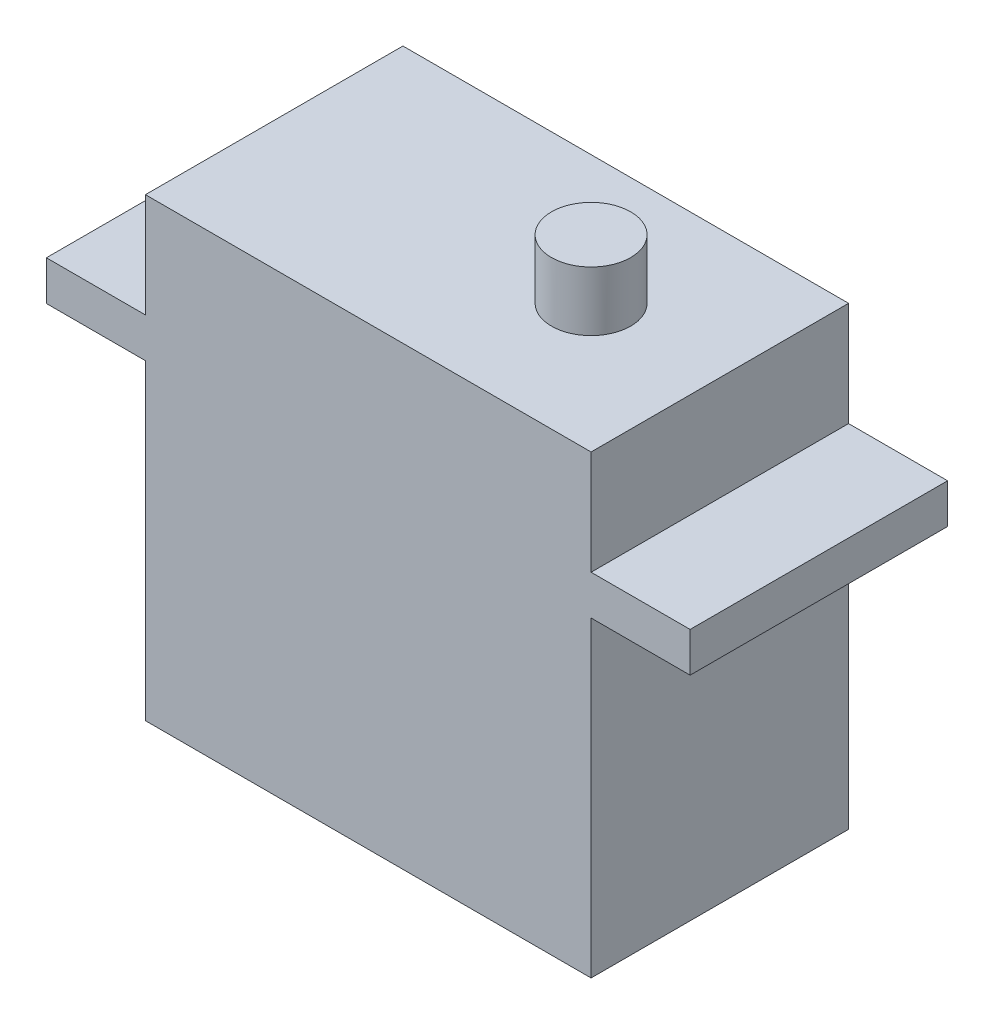
ISO-10303-21;
HEADER;
FILE_DESCRIPTION(('STEP AP214'),'2;1');
FILE_NAME('part.step','',(''),(''),'','','');
FILE_SCHEMA(('AUTOMOTIVE_DESIGN { 1 0 10303 214 1 1 1 1 }'));
ENDSEC;
DATA;
#1=APPLICATION_CONTEXT('core data for automotive mechanical design processes');
#2=APPLICATION_PROTOCOL_DEFINITION('international standard','automotive_design',2000,#1);
#3=PRODUCT_CONTEXT('',#1,'mechanical');
#4=PRODUCT('Part','Part','',(#3));
#5=PRODUCT_RELATED_PRODUCT_CATEGORY('part','',(#4));
#6=PRODUCT_DEFINITION_FORMATION('','',#4);
#7=PRODUCT_DEFINITION_CONTEXT('part definition',#1,'design');
#8=PRODUCT_DEFINITION('design','',#6,#7);
#9=PRODUCT_DEFINITION_SHAPE('','',#8);
#10=(LENGTH_UNIT() NAMED_UNIT(*) SI_UNIT(.MILLI.,.METRE.));
#11=(NAMED_UNIT(*) PLANE_ANGLE_UNIT() SI_UNIT($,.RADIAN.));
#12=(NAMED_UNIT(*) SI_UNIT($,.STERADIAN.) SOLID_ANGLE_UNIT());
#13=UNCERTAINTY_MEASURE_WITH_UNIT(LENGTH_MEASURE(1.E-05),#10,'distance_accuracy_value','');
#14=(GEOMETRIC_REPRESENTATION_CONTEXT(3) GLOBAL_UNCERTAINTY_ASSIGNED_CONTEXT((#13)) GLOBAL_UNIT_ASSIGNED_CONTEXT((#10,
#11,#12)) REPRESENTATION_CONTEXT('',''));
#15=CARTESIAN_POINT('',(0.,0.,0.));
#16=DIRECTION('',(0.,0.,1.));
#17=DIRECTION('',(1.,0.,0.));
#18=AXIS2_PLACEMENT_3D('',#15,#16,#17);
#19=CARTESIAN_POINT('',(-30.9036363636364,29.7093162393162,13.));
#20=DIRECTION('',(0.,-1.,0.));
#21=DIRECTION('',(0.,0.,-1.));
#22=AXIS2_PLACEMENT_3D('',#19,#20,#21);
#23=PLANE('',#22);
#24=DIRECTION('',(-1.,0.,0.));
#25=VECTOR('',#24,1.);
#26=CARTESIAN_POINT('',(-30.9036363636364,29.7093162393162,0.));
#27=LINE('',#26,#25);
#28=CARTESIAN_POINT('',(-8.40363636363642,29.7093162393162,0.));
#29=VERTEX_POINT('',#28);
#30=CARTESIAN_POINT('',(-30.9036363636364,29.7093162393162,0.));
#31=VERTEX_POINT('',#30);
#32=EDGE_CURVE('E152',#29,#31,#27,.T.);
#33=ORIENTED_EDGE('',*,*,#32,.T.);
#34=DIRECTION('',(0.,0.,-1.));
#35=VECTOR('',#34,1.);
#36=CARTESIAN_POINT('',(-30.9036363636364,29.7093162393162,13.));
#37=LINE('',#36,#35);
#38=CARTESIAN_POINT('',(-30.9036363636364,29.7093162393162,13.));
#39=VERTEX_POINT('',#38);
#40=EDGE_CURVE('E39',#39,#31,#37,.T.);
#41=ORIENTED_EDGE('',*,*,#40,.F.);
#42=DIRECTION('',(-1.,0.,0.));
#43=VECTOR('',#42,1.);
#44=CARTESIAN_POINT('',(-30.9036363636364,29.7093162393162,13.));
#45=LINE('',#44,#43);
#46=CARTESIAN_POINT('',(-8.40363636363642,29.7093162393162,13.));
#47=VERTEX_POINT('',#46);
#48=EDGE_CURVE('E175',#47,#39,#45,.T.);
#49=ORIENTED_EDGE('',*,*,#48,.F.);
#50=DIRECTION('',(0.,0.,-1.));
#51=VECTOR('',#50,1.);
#52=CARTESIAN_POINT('',(-8.40363636363642,29.7093162393162,13.));
#53=LINE('',#52,#51);
#54=EDGE_CURVE('E148',#47,#29,#53,.T.);
#55=ORIENTED_EDGE('',*,*,#54,.T.);
#56=EDGE_LOOP('',(#33,#41,#49,#55));
#57=FACE_BOUND('',#56,.T.);
#58=CARTESIAN_POINT('',(-14.9036363636364,29.7093162393162,6.5));
#59=DIRECTION('',(0.,-1.,0.));
#60=DIRECTION('',(0.,0.,-1.));
#61=AXIS2_PLACEMENT_3D('',#58,#59,#60);
#62=CIRCLE('',#61,2.);
#63=CARTESIAN_POINT('',(-14.9036363636364,29.7093162393162,4.5));
#64=VERTEX_POINT('',#63);
#65=EDGE_CURVE('E11',#64,#64,#62,.F.);
#66=ORIENTED_EDGE('',*,*,#65,.F.);
#67=EDGE_LOOP('',(#66));
#68=FACE_BOUND('',#67,.T.);
#69=ADVANCED_FACE('F31',(#57,#68),#23,.F.);
#70=CARTESIAN_POINT('',(-30.9036363636364,29.7093162393162,13.));
#71=DIRECTION('',(1.,0.,0.));
#72=DIRECTION('',(0.,0.,-1.));
#73=AXIS2_PLACEMENT_3D('',#70,#71,#72);
#74=PLANE('',#73);
#75=DIRECTION('',(0.,-1.,0.));
#76=VECTOR('',#75,1.);
#77=CARTESIAN_POINT('',(-30.9036363636364,29.7093162393162,0.));
#78=LINE('',#77,#76);
#79=CARTESIAN_POINT('',(-30.9036363636364,24.4503205421149,0.));
#80=VERTEX_POINT('',#79);
#81=EDGE_CURVE('E155',#31,#80,#78,.T.);
#82=ORIENTED_EDGE('',*,*,#81,.T.);
#83=DIRECTION('',(0.,0.,-1.));
#84=VECTOR('',#83,1.);
#85=CARTESIAN_POINT('',(-30.9036363636364,24.4503205421149,13.));
#86=LINE('',#85,#84);
#87=CARTESIAN_POINT('',(-30.9036363636364,24.4503205421149,13.));
#88=VERTEX_POINT('',#87);
#89=EDGE_CURVE('E197',#88,#80,#86,.T.);
#90=ORIENTED_EDGE('',*,*,#89,.F.);
#91=DIRECTION('',(0.,-1.,0.));
#92=VECTOR('',#91,1.);
#93=CARTESIAN_POINT('',(-30.9036363636364,29.7093162393162,13.));
#94=LINE('',#93,#92);
#95=EDGE_CURVE('E103',#39,#88,#94,.T.);
#96=ORIENTED_EDGE('',*,*,#95,.F.);
#97=ORIENTED_EDGE('',*,*,#40,.T.);
#98=EDGE_LOOP('',(#82,#90,#96,#97));
#99=FACE_BOUND('',#98,.T.);
#100=ADVANCED_FACE('F200',(#99),#74,.F.);
#101=CARTESIAN_POINT('',(-30.9036363636364,24.4503205421149,13.));
#102=DIRECTION('',(0.,-1.,0.));
#103=DIRECTION('',(0.,0.,-1.));
#104=AXIS2_PLACEMENT_3D('',#101,#102,#103);
#105=PLANE('',#104);
#106=DIRECTION('',(-1.,0.,0.));
#107=VECTOR('',#106,1.);
#108=CARTESIAN_POINT('',(-30.9036363636364,24.4503205421149,0.));
#109=LINE('',#108,#107);
#110=CARTESIAN_POINT('',(-35.9036363636364,24.4503205421149,0.));
#111=VERTEX_POINT('',#110);
#112=EDGE_CURVE('E158',#80,#111,#109,.T.);
#113=ORIENTED_EDGE('',*,*,#112,.T.);
#114=DIRECTION('',(0.,0.,-1.));
#115=VECTOR('',#114,1.);
#116=CARTESIAN_POINT('',(-35.9036363636364,24.4503205421149,13.));
#117=LINE('',#116,#115);
#118=CARTESIAN_POINT('',(-35.9036363636364,24.4503205421149,13.));
#119=VERTEX_POINT('',#118);
#120=EDGE_CURVE('E194',#119,#111,#117,.T.);
#121=ORIENTED_EDGE('',*,*,#120,.F.);
#122=DIRECTION('',(-1.,0.,0.));
#123=VECTOR('',#122,1.);
#124=CARTESIAN_POINT('',(-30.9036363636364,24.4503205421149,13.));
#125=LINE('',#124,#123);
#126=EDGE_CURVE('E221',#88,#119,#125,.T.);
#127=ORIENTED_EDGE('',*,*,#126,.F.);
#128=ORIENTED_EDGE('',*,*,#89,.T.);
#129=EDGE_LOOP('',(#113,#121,#127,#128));
#130=FACE_BOUND('',#129,.T.);
#131=ADVANCED_FACE('F212',(#130),#105,.F.);
#132=CARTESIAN_POINT('',(-35.9036363636364,24.4503205421149,13.));
#133=DIRECTION('',(1.,0.,0.));
#134=DIRECTION('',(0.,0.,-1.));
#135=AXIS2_PLACEMENT_3D('',#132,#133,#134);
#136=PLANE('',#135);
#137=DIRECTION('',(0.,-1.,0.));
#138=VECTOR('',#137,1.);
#139=CARTESIAN_POINT('',(-35.9036363636364,24.4503205421149,0.));
#140=LINE('',#139,#138);
#141=CARTESIAN_POINT('',(-35.9036363636364,22.4503205421149,0.));
#142=VERTEX_POINT('',#141);
#143=EDGE_CURVE('E160',#111,#142,#140,.T.);
#144=ORIENTED_EDGE('',*,*,#143,.T.);
#145=DIRECTION('',(0.,0.,-1.));
#146=VECTOR('',#145,1.);
#147=CARTESIAN_POINT('',(-35.9036363636364,22.4503205421149,13.));
#148=LINE('',#147,#146);
#149=CARTESIAN_POINT('',(-35.9036363636364,22.4503205421149,13.));
#150=VERTEX_POINT('',#149);
#151=EDGE_CURVE('E191',#150,#142,#148,.T.);
#152=ORIENTED_EDGE('',*,*,#151,.F.);
#153=DIRECTION('',(0.,-1.,0.));
#154=VECTOR('',#153,1.);
#155=CARTESIAN_POINT('',(-35.9036363636364,24.4503205421149,13.));
#156=LINE('',#155,#154);
#157=EDGE_CURVE('E218',#119,#150,#156,.T.);
#158=ORIENTED_EDGE('',*,*,#157,.F.);
#159=ORIENTED_EDGE('',*,*,#120,.T.);
#160=EDGE_LOOP('',(#144,#152,#158,#159));
#161=FACE_BOUND('',#160,.T.);
#162=ADVANCED_FACE('F216',(#161),#136,.F.);
#163=CARTESIAN_POINT('',(-35.9036363636364,22.4503205421149,13.));
#164=DIRECTION('',(0.,1.,0.));
#165=DIRECTION('',(-1.,0.,0.));
#166=AXIS2_PLACEMENT_3D('',#163,#164,#165);
#167=PLANE('',#166);
#168=DIRECTION('',(1.,0.,0.));
#169=VECTOR('',#168,1.);
#170=CARTESIAN_POINT('',(-35.9036363636364,22.4503205421149,0.));
#171=LINE('',#170,#169);
#172=CARTESIAN_POINT('',(-30.9036363636364,22.4503205421149,0.));
#173=VERTEX_POINT('',#172);
#174=EDGE_CURVE('E162',#142,#173,#171,.T.);
#175=ORIENTED_EDGE('',*,*,#174,.T.);
#176=DIRECTION('',(0.,0.,-1.));
#177=VECTOR('',#176,1.);
#178=CARTESIAN_POINT('',(-30.9036363636364,22.4503205421149,13.));
#179=LINE('',#178,#177);
#180=CARTESIAN_POINT('',(-30.9036363636364,22.4503205421149,13.));
#181=VERTEX_POINT('',#180);
#182=EDGE_CURVE('E188',#181,#173,#179,.T.);
#183=ORIENTED_EDGE('',*,*,#182,.F.);
#184=DIRECTION('',(1.,0.,0.));
#185=VECTOR('',#184,1.);
#186=CARTESIAN_POINT('',(-35.9036363636364,22.4503205421149,13.));
#187=LINE('',#186,#185);
#188=EDGE_CURVE('E220',#150,#181,#187,.T.);
#189=ORIENTED_EDGE('',*,*,#188,.F.);
#190=ORIENTED_EDGE('',*,*,#151,.T.);
#191=EDGE_LOOP('',(#175,#183,#189,#190));
#192=FACE_BOUND('',#191,.T.);
#193=ADVANCED_FACE('F252',(#192),#167,.F.);
#194=CARTESIAN_POINT('',(-30.9036363636364,22.4503205421149,13.));
#195=DIRECTION('',(1.,0.,0.));
#196=DIRECTION('',(0.,1.,0.));
#197=AXIS2_PLACEMENT_3D('',#194,#195,#196);
#198=PLANE('',#197);
#199=DIRECTION('',(0.,-1.,0.));
#200=VECTOR('',#199,1.);
#201=CARTESIAN_POINT('',(-30.9036363636364,22.4503205421149,0.));
#202=LINE('',#201,#200);
#203=CARTESIAN_POINT('',(-30.9036363636364,6.70931623931625,0.));
#204=VERTEX_POINT('',#203);
#205=EDGE_CURVE('E164',#173,#204,#202,.T.);
#206=ORIENTED_EDGE('',*,*,#205,.T.);
#207=DIRECTION('',(0.,0.,-1.));
#208=VECTOR('',#207,1.);
#209=CARTESIAN_POINT('',(-30.9036363636364,6.70931623931625,13.));
#210=LINE('',#209,#208);
#211=CARTESIAN_POINT('',(-30.9036363636364,6.70931623931625,13.));
#212=VERTEX_POINT('',#211);
#213=EDGE_CURVE('E185',#212,#204,#210,.T.);
#214=ORIENTED_EDGE('',*,*,#213,.F.);
#215=DIRECTION('',(0.,-1.,0.));
#216=VECTOR('',#215,1.);
#217=CARTESIAN_POINT('',(-30.9036363636364,22.4503205421149,13.));
#218=LINE('',#217,#216);
#219=EDGE_CURVE('E223',#181,#212,#218,.T.);
#220=ORIENTED_EDGE('',*,*,#219,.F.);
#221=ORIENTED_EDGE('',*,*,#182,.T.);
#222=EDGE_LOOP('',(#206,#214,#220,#221));
#223=FACE_BOUND('',#222,.T.);
#224=ADVANCED_FACE('F249',(#223),#198,.F.);
#225=CARTESIAN_POINT('',(-30.9036363636364,6.70931623931625,13.));
#226=DIRECTION('',(0.,1.,0.));
#227=DIRECTION('',(0.,0.,1.));
#228=AXIS2_PLACEMENT_3D('',#225,#226,#227);
#229=PLANE('',#228);
#230=DIRECTION('',(1.,0.,0.));
#231=VECTOR('',#230,1.);
#232=CARTESIAN_POINT('',(-30.9036363636364,6.70931623931625,0.));
#233=LINE('',#232,#231);
#234=CARTESIAN_POINT('',(-8.40363636363642,6.70931623931625,0.));
#235=VERTEX_POINT('',#234);
#236=EDGE_CURVE('E166',#204,#235,#233,.T.);
#237=ORIENTED_EDGE('',*,*,#236,.T.);
#238=DIRECTION('',(0.,0.,-1.));
#239=VECTOR('',#238,1.);
#240=CARTESIAN_POINT('',(-8.40363636363642,6.70931623931625,13.));
#241=LINE('',#240,#239);
#242=CARTESIAN_POINT('',(-8.40363636363642,6.70931623931625,13.));
#243=VERTEX_POINT('',#242);
#244=EDGE_CURVE('E182',#243,#235,#241,.T.);
#245=ORIENTED_EDGE('',*,*,#244,.F.);
#246=DIRECTION('',(1.,0.,0.));
#247=VECTOR('',#246,1.);
#248=CARTESIAN_POINT('',(-30.9036363636364,6.70931623931625,13.));
#249=LINE('',#248,#247);
#250=EDGE_CURVE('E229',#212,#243,#249,.T.);
#251=ORIENTED_EDGE('',*,*,#250,.F.);
#252=ORIENTED_EDGE('',*,*,#213,.T.);
#253=EDGE_LOOP('',(#237,#245,#251,#252));
#254=FACE_BOUND('',#253,.T.);
#255=ADVANCED_FACE('F245',(#254),#229,.F.);
#256=CARTESIAN_POINT('',(-8.40363636363642,22.4503205421149,13.));
#257=DIRECTION('',(-1.,0.,0.));
#258=DIRECTION('',(0.,-1.,0.));
#259=AXIS2_PLACEMENT_3D('',#256,#257,#258);
#260=PLANE('',#259);
#261=DIRECTION('',(0.,1.,0.));
#262=VECTOR('',#261,1.);
#263=CARTESIAN_POINT('',(-8.40363636363642,22.4503205421149,0.));
#264=LINE('',#263,#262);
#265=CARTESIAN_POINT('',(-8.40363636363642,22.4503205421149,0.));
#266=VERTEX_POINT('',#265);
#267=EDGE_CURVE('E168',#235,#266,#264,.T.);
#268=ORIENTED_EDGE('',*,*,#267,.T.);
#269=DIRECTION('',(0.,0.,-1.));
#270=VECTOR('',#269,1.);
#271=CARTESIAN_POINT('',(-8.40363636363642,22.4503205421149,13.));
#272=LINE('',#271,#270);
#273=CARTESIAN_POINT('',(-8.40363636363642,22.4503205421149,13.));
#274=VERTEX_POINT('',#273);
#275=EDGE_CURVE('E179',#274,#266,#272,.T.);
#276=ORIENTED_EDGE('',*,*,#275,.F.);
#277=DIRECTION('',(0.,1.,0.));
#278=VECTOR('',#277,1.);
#279=CARTESIAN_POINT('',(-8.40363636363642,22.4503205421149,13.));
#280=LINE('',#279,#278);
#281=EDGE_CURVE('E231',#243,#274,#280,.T.);
#282=ORIENTED_EDGE('',*,*,#281,.F.);
#283=ORIENTED_EDGE('',*,*,#244,.T.);
#284=EDGE_LOOP('',(#268,#276,#282,#283));
#285=FACE_BOUND('',#284,.T.);
#286=ADVANCED_FACE('F237',(#285),#260,.F.);
#287=CARTESIAN_POINT('',(-3.40363636363642,22.4503205421149,13.));
#288=DIRECTION('',(0.,1.,0.));
#289=DIRECTION('',(-1.,0.,0.));
#290=AXIS2_PLACEMENT_3D('',#287,#288,#289);
#291=PLANE('',#290);
#292=DIRECTION('',(1.,0.,0.));
#293=VECTOR('',#292,1.);
#294=CARTESIAN_POINT('',(-3.40363636363642,22.4503205421149,0.));
#295=LINE('',#294,#293);
#296=CARTESIAN_POINT('',(-3.40363636363642,22.4503205421149,0.));
#297=VERTEX_POINT('',#296);
#298=EDGE_CURVE('E170',#266,#297,#295,.T.);
#299=ORIENTED_EDGE('',*,*,#298,.T.);
#300=DIRECTION('',(0.,0.,-1.));
#301=VECTOR('',#300,1.);
#302=CARTESIAN_POINT('',(-3.40363636363642,22.4503205421149,13.));
#303=LINE('',#302,#301);
#304=CARTESIAN_POINT('',(-3.40363636363642,22.4503205421149,13.));
#305=VERTEX_POINT('',#304);
#306=EDGE_CURVE('E143',#305,#297,#303,.T.);
#307=ORIENTED_EDGE('',*,*,#306,.F.);
#308=DIRECTION('',(1.,0.,0.));
#309=VECTOR('',#308,1.);
#310=CARTESIAN_POINT('',(-3.40363636363642,22.4503205421149,13.));
#311=LINE('',#310,#309);
#312=EDGE_CURVE('E134',#274,#305,#311,.T.);
#313=ORIENTED_EDGE('',*,*,#312,.F.);
#314=ORIENTED_EDGE('',*,*,#275,.T.);
#315=EDGE_LOOP('',(#299,#307,#313,#314));
#316=FACE_BOUND('',#315,.T.);
#317=ADVANCED_FACE('F241',(#316),#291,.F.);
#318=CARTESIAN_POINT('',(-3.40363636363642,24.4503205421149,13.));
#319=DIRECTION('',(-1.,0.,0.));
#320=DIRECTION('',(0.,0.,1.));
#321=AXIS2_PLACEMENT_3D('',#318,#319,#320);
#322=PLANE('',#321);
#323=DIRECTION('',(0.,1.,0.));
#324=VECTOR('',#323,1.);
#325=CARTESIAN_POINT('',(-3.40363636363642,24.4503205421149,0.));
#326=LINE('',#325,#324);
#327=CARTESIAN_POINT('',(-3.40363636363642,24.4503205421149,0.));
#328=VERTEX_POINT('',#327);
#329=EDGE_CURVE('E142',#297,#328,#326,.T.);
#330=ORIENTED_EDGE('',*,*,#329,.T.);
#331=DIRECTION('',(0.,0.,-1.));
#332=VECTOR('',#331,1.);
#333=CARTESIAN_POINT('',(-3.40363636363642,24.4503205421149,13.));
#334=LINE('',#333,#332);
#335=CARTESIAN_POINT('',(-3.40363636363642,24.4503205421149,13.));
#336=VERTEX_POINT('',#335);
#337=EDGE_CURVE('E139',#336,#328,#334,.T.);
#338=ORIENTED_EDGE('',*,*,#337,.F.);
#339=DIRECTION('',(0.,1.,0.));
#340=VECTOR('',#339,1.);
#341=CARTESIAN_POINT('',(-3.40363636363642,24.4503205421149,13.));
#342=LINE('',#341,#340);
#343=EDGE_CURVE('E128',#305,#336,#342,.T.);
#344=ORIENTED_EDGE('',*,*,#343,.F.);
#345=ORIENTED_EDGE('',*,*,#306,.T.);
#346=EDGE_LOOP('',(#330,#338,#344,#345));
#347=FACE_BOUND('',#346,.T.);
#348=ADVANCED_FACE('F140',(#347),#322,.F.);
#349=CARTESIAN_POINT('',(-8.40363636363642,24.4503205421149,13.));
#350=DIRECTION('',(0.,-1.,0.));
#351=DIRECTION('',(0.,0.,-1.));
#352=AXIS2_PLACEMENT_3D('',#349,#350,#351);
#353=PLANE('',#352);
#354=DIRECTION('',(-1.,0.,0.));
#355=VECTOR('',#354,1.);
#356=CARTESIAN_POINT('',(-8.40363636363642,24.4503205421149,0.));
#357=LINE('',#356,#355);
#358=CARTESIAN_POINT('',(-8.40363636363642,24.4503205421149,0.));
#359=VERTEX_POINT('',#358);
#360=EDGE_CURVE('E88',#328,#359,#357,.T.);
#361=ORIENTED_EDGE('',*,*,#360,.T.);
#362=DIRECTION('',(0.,0.,-1.));
#363=VECTOR('',#362,1.);
#364=CARTESIAN_POINT('',(-8.40363636363642,24.4503205421149,13.));
#365=LINE('',#364,#363);
#366=CARTESIAN_POINT('',(-8.40363636363642,24.4503205421149,13.));
#367=VERTEX_POINT('',#366);
#368=EDGE_CURVE('E144',#367,#359,#365,.T.);
#369=ORIENTED_EDGE('',*,*,#368,.F.);
#370=DIRECTION('',(-1.,0.,0.));
#371=VECTOR('',#370,1.);
#372=CARTESIAN_POINT('',(-8.40363636363642,24.4503205421149,13.));
#373=LINE('',#372,#371);
#374=EDGE_CURVE('E132',#336,#367,#373,.T.);
#375=ORIENTED_EDGE('',*,*,#374,.F.);
#376=ORIENTED_EDGE('',*,*,#337,.T.);
#377=EDGE_LOOP('',(#361,#369,#375,#376));
#378=FACE_BOUND('',#377,.T.);
#379=ADVANCED_FACE('F146',(#378),#353,.F.);
#380=CARTESIAN_POINT('',(-8.40363636363642,29.7093162393162,13.));
#381=DIRECTION('',(-1.,0.,0.));
#382=DIRECTION('',(0.,0.,1.));
#383=AXIS2_PLACEMENT_3D('',#380,#381,#382);
#384=PLANE('',#383);
#385=DIRECTION('',(0.,1.,0.));
#386=VECTOR('',#385,1.);
#387=CARTESIAN_POINT('',(-8.40363636363642,29.7093162393162,0.));
#388=LINE('',#387,#386);
#389=EDGE_CURVE('E94',#359,#29,#388,.T.);
#390=ORIENTED_EDGE('',*,*,#389,.T.);
#391=ORIENTED_EDGE('',*,*,#54,.F.);
#392=DIRECTION('',(0.,1.,0.));
#393=VECTOR('',#392,1.);
#394=CARTESIAN_POINT('',(-8.40363636363642,29.7093162393162,13.));
#395=LINE('',#394,#393);
#396=EDGE_CURVE('E47',#367,#47,#395,.T.);
#397=ORIENTED_EDGE('',*,*,#396,.F.);
#398=ORIENTED_EDGE('',*,*,#368,.T.);
#399=EDGE_LOOP('',(#390,#391,#397,#398));
#400=FACE_BOUND('',#399,.T.);
#401=ADVANCED_FACE('F326',(#400),#384,.F.);
#402=CARTESIAN_POINT('',(-8.40363636363642,29.7093162393162,13.));
#403=DIRECTION('',(0.,0.,-1.));
#404=DIRECTION('',(-1.,0.,0.));
#405=AXIS2_PLACEMENT_3D('',#402,#403,#404);
#406=PLANE('',#405);
#407=ORIENTED_EDGE('',*,*,#48,.T.);
#408=ORIENTED_EDGE('',*,*,#95,.T.);
#409=ORIENTED_EDGE('',*,*,#126,.T.);
#410=ORIENTED_EDGE('',*,*,#157,.T.);
#411=ORIENTED_EDGE('',*,*,#188,.T.);
#412=ORIENTED_EDGE('',*,*,#219,.T.);
#413=ORIENTED_EDGE('',*,*,#250,.T.);
#414=ORIENTED_EDGE('',*,*,#281,.T.);
#415=ORIENTED_EDGE('',*,*,#312,.T.);
#416=ORIENTED_EDGE('',*,*,#343,.T.);
#417=ORIENTED_EDGE('',*,*,#374,.T.);
#418=ORIENTED_EDGE('',*,*,#396,.T.);
#419=EDGE_LOOP('',(#407,#408,#409,#410,#411,#412,#413,#414,#415,#416,#417,#418));
#420=FACE_BOUND('',#419,.T.);
#421=ADVANCED_FACE('F130',(#420),#406,.F.);
#422=CARTESIAN_POINT('',(-8.40363636363642,29.7093162393162,0.));
#423=DIRECTION('',(0.,0.,-1.));
#424=DIRECTION('',(-1.,0.,0.));
#425=AXIS2_PLACEMENT_3D('',#422,#423,#424);
#426=PLANE('',#425);
#427=ORIENTED_EDGE('',*,*,#32,.F.);
#428=ORIENTED_EDGE('',*,*,#389,.F.);
#429=ORIENTED_EDGE('',*,*,#360,.F.);
#430=ORIENTED_EDGE('',*,*,#329,.F.);
#431=ORIENTED_EDGE('',*,*,#298,.F.);
#432=ORIENTED_EDGE('',*,*,#267,.F.);
#433=ORIENTED_EDGE('',*,*,#236,.F.);
#434=ORIENTED_EDGE('',*,*,#205,.F.);
#435=ORIENTED_EDGE('',*,*,#174,.F.);
#436=ORIENTED_EDGE('',*,*,#143,.F.);
#437=ORIENTED_EDGE('',*,*,#112,.F.);
#438=ORIENTED_EDGE('',*,*,#81,.F.);
#439=EDGE_LOOP('',(#427,#428,#429,#430,#431,#432,#433,#434,#435,#436,#437,#438));
#440=FACE_BOUND('',#439,.T.);
#441=ADVANCED_FACE('F206',(#440),#426,.T.);
#442=CARTESIAN_POINT('',(-14.9036363636364,32.7093162393163,6.5));
#443=DIRECTION('',(0.,-1.,0.));
#444=DIRECTION('',(0.,0.,-1.));
#445=AXIS2_PLACEMENT_3D('',#442,#443,#444);
#446=CYLINDRICAL_SURFACE('',#445,2.);
#447=CARTESIAN_POINT('',(-14.9036363636364,32.7093162393163,6.5));
#448=DIRECTION('',(0.,1.,0.));
#449=DIRECTION('',(0.,0.,1.));
#450=AXIS2_PLACEMENT_3D('',#447,#448,#449);
#451=CIRCLE('',#450,2.);
#452=CARTESIAN_POINT('',(-14.9036363636364,32.7093162393163,8.5));
#453=VERTEX_POINT('',#452);
#454=EDGE_CURVE('E156',#453,#453,#451,.T.);
#455=ORIENTED_EDGE('',*,*,#454,.F.);
#456=EDGE_LOOP('',(#455));
#457=FACE_BOUND('',#456,.T.);
#458=ORIENTED_EDGE('',*,*,#65,.T.);
#459=EDGE_LOOP('',(#458));
#460=FACE_BOUND('',#459,.T.);
#461=ADVANCED_FACE('F350',(#457,#460),#446,.T.);
#462=CARTESIAN_POINT('',(-14.9036363636364,32.7093162393163,6.5));
#463=DIRECTION('',(0.,1.,0.));
#464=DIRECTION('',(0.,0.,1.));
#465=AXIS2_PLACEMENT_3D('',#462,#463,#464);
#466=PLANE('',#465);
#467=ORIENTED_EDGE('',*,*,#454,.T.);
#468=EDGE_LOOP('',(#467));
#469=FACE_BOUND('',#468,.T.);
#470=ADVANCED_FACE('F364',(#469),#466,.T.);
#471=CLOSED_SHELL('',(#69,#100,#131,#162,#193,#224,#255,#286,#317,#348,#379,#401,#421,#441,#461,#470));
#472=MANIFOLD_SOLID_BREP('B2',#471);
#473=ADVANCED_BREP_SHAPE_REPRESENTATION('',(#18,#472),#14);
#474=SHAPE_DEFINITION_REPRESENTATION(#9,#473);
ENDSEC;
END-ISO-10303-21;
